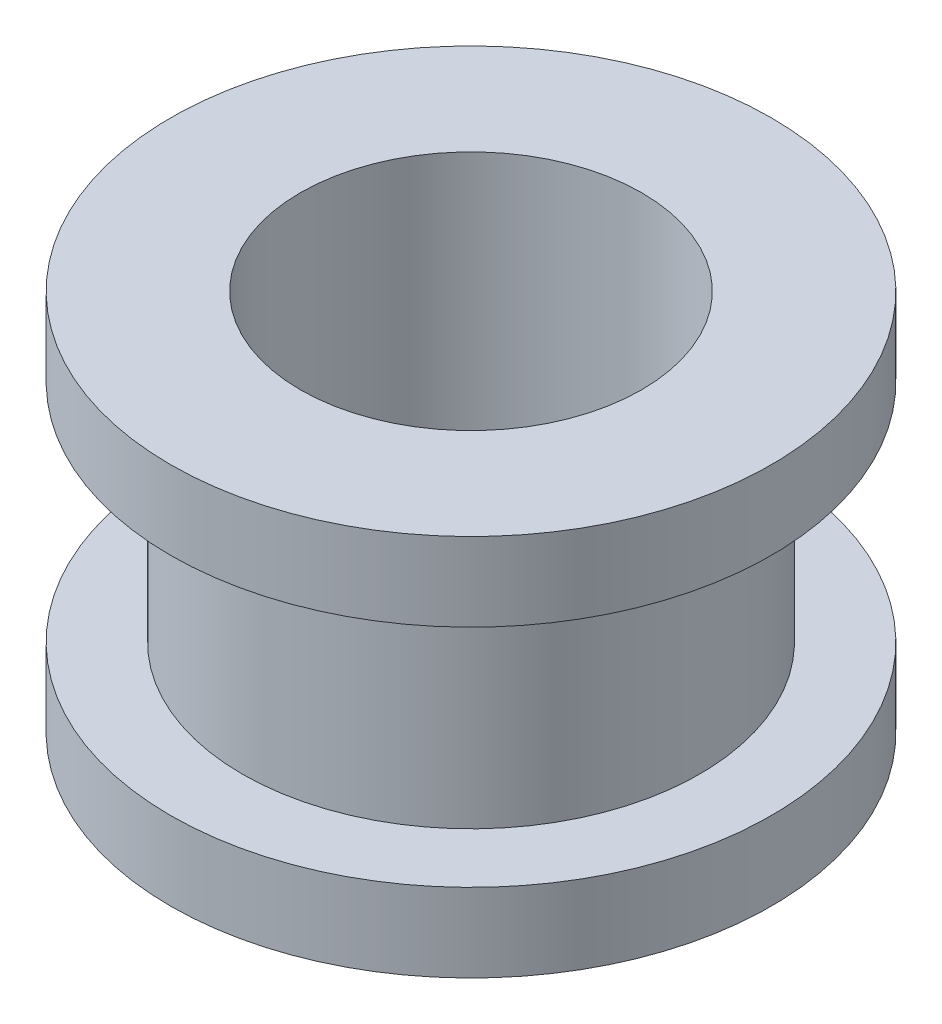
ISO-10303-21;
HEADER;
FILE_DESCRIPTION(('STEP AP214'),'2;1');
FILE_NAME('part.step','',(''),(''),'','','');
FILE_SCHEMA(('AUTOMOTIVE_DESIGN { 1 0 10303 214 1 1 1 1 }'));
ENDSEC;
DATA;
#1=APPLICATION_CONTEXT('core data for automotive mechanical design processes');
#2=APPLICATION_PROTOCOL_DEFINITION('international standard','automotive_design',2000,#1);
#3=PRODUCT_CONTEXT('',#1,'mechanical');
#4=PRODUCT('Part','Part','',(#3));
#5=PRODUCT_RELATED_PRODUCT_CATEGORY('part','',(#4));
#6=PRODUCT_DEFINITION_FORMATION('','',#4);
#7=PRODUCT_DEFINITION_CONTEXT('part definition',#1,'design');
#8=PRODUCT_DEFINITION('design','',#6,#7);
#9=PRODUCT_DEFINITION_SHAPE('','',#8);
#10=(LENGTH_UNIT() NAMED_UNIT(*) SI_UNIT(.MILLI.,.METRE.));
#11=(NAMED_UNIT(*) PLANE_ANGLE_UNIT() SI_UNIT($,.RADIAN.));
#12=(NAMED_UNIT(*) SI_UNIT($,.STERADIAN.) SOLID_ANGLE_UNIT());
#13=UNCERTAINTY_MEASURE_WITH_UNIT(LENGTH_MEASURE(1.E-05),#10,'distance_accuracy_value','');
#14=(GEOMETRIC_REPRESENTATION_CONTEXT(3) GLOBAL_UNCERTAINTY_ASSIGNED_CONTEXT((#13)) GLOBAL_UNIT_ASSIGNED_CONTEXT((#10,
#11,#12)) REPRESENTATION_CONTEXT('',''));
#15=CARTESIAN_POINT('',(0.,0.,0.));
#16=DIRECTION('',(0.,0.,1.));
#17=DIRECTION('',(1.,0.,0.));
#18=AXIS2_PLACEMENT_3D('',#15,#16,#17);
#19=CARTESIAN_POINT('',(0.,5.6,0.));
#20=DIRECTION('',(0.,-1.,0.));
#21=DIRECTION('',(0.,0.,-1.));
#22=AXIS2_PLACEMENT_3D('',#19,#20,#21);
#23=PLANE('',#22);
#24=CARTESIAN_POINT('',(0.,5.6,0.));
#25=DIRECTION('',(0.,1.,0.));
#26=DIRECTION('',(0.,0.,1.));
#27=AXIS2_PLACEMENT_3D('',#24,#25,#26);
#28=CIRCLE('',#27,5.);
#29=CARTESIAN_POINT('',(0.,5.6,5.));
#30=VERTEX_POINT('',#29);
#31=EDGE_CURVE('E63',#30,#30,#28,.T.);
#32=ORIENTED_EDGE('',*,*,#31,.F.);
#33=EDGE_LOOP('',(#32));
#34=FACE_BOUND('',#33,.T.);
#35=CARTESIAN_POINT('',(0.,5.6,0.));
#36=DIRECTION('',(0.,-1.,0.));
#37=DIRECTION('',(0.,0.,-1.));
#38=AXIS2_PLACEMENT_3D('',#35,#36,#37);
#39=CIRCLE('',#38,8.8);
#40=CARTESIAN_POINT('',(0.,5.6,-8.8));
#41=VERTEX_POINT('',#40);
#42=EDGE_CURVE('E10',#41,#41,#39,.T.);
#43=ORIENTED_EDGE('',*,*,#42,.F.);
#44=EDGE_LOOP('',(#43));
#45=FACE_BOUND('',#44,.T.);
#46=ADVANCED_FACE('F35',(#34,#45),#23,.F.);
#47=CARTESIAN_POINT('',(0.,-5.6,0.));
#48=DIRECTION('',(0.,-1.,0.));
#49=DIRECTION('',(0.,0.,-1.));
#50=AXIS2_PLACEMENT_3D('',#47,#48,#49);
#51=CYLINDRICAL_SURFACE('',#50,8.8);
#52=CARTESIAN_POINT('',(0.,3.3,0.));
#53=DIRECTION('',(0.,-1.,0.));
#54=DIRECTION('',(0.,0.,-1.));
#55=AXIS2_PLACEMENT_3D('',#52,#53,#54);
#56=CIRCLE('',#55,8.8);
#57=CARTESIAN_POINT('',(0.,3.3,-8.8));
#58=VERTEX_POINT('',#57);
#59=EDGE_CURVE('E41',#58,#58,#56,.T.);
#60=ORIENTED_EDGE('',*,*,#59,.F.);
#61=EDGE_LOOP('',(#60));
#62=FACE_BOUND('',#61,.T.);
#63=ORIENTED_EDGE('',*,*,#42,.T.);
#64=EDGE_LOOP('',(#63));
#65=FACE_BOUND('',#64,.T.);
#66=ADVANCED_FACE('F71',(#62,#65),#51,.T.);
#67=CARTESIAN_POINT('',(-8.8,3.3,0.));
#68=DIRECTION('',(0.,1.,0.));
#69=DIRECTION('',(0.,0.,1.));
#70=AXIS2_PLACEMENT_3D('',#67,#68,#69);
#71=PLANE('',#70);
#72=CARTESIAN_POINT('',(0.,3.3,0.));
#73=DIRECTION('',(0.,-1.,0.));
#74=DIRECTION('',(0.,0.,-1.));
#75=AXIS2_PLACEMENT_3D('',#72,#73,#74);
#76=CIRCLE('',#75,6.7);
#77=CARTESIAN_POINT('',(0.,3.3,-6.7));
#78=VERTEX_POINT('',#77);
#79=EDGE_CURVE('E45',#78,#78,#76,.T.);
#80=ORIENTED_EDGE('',*,*,#79,.F.);
#81=EDGE_LOOP('',(#80));
#82=FACE_BOUND('',#81,.T.);
#83=ORIENTED_EDGE('',*,*,#59,.T.);
#84=EDGE_LOOP('',(#83));
#85=FACE_BOUND('',#84,.T.);
#86=ADVANCED_FACE('F77',(#82,#85),#71,.F.);
#87=CARTESIAN_POINT('',(0.,-5.6,0.));
#88=DIRECTION('',(0.,-1.,0.));
#89=DIRECTION('',(0.,0.,-1.));
#90=AXIS2_PLACEMENT_3D('',#87,#88,#89);
#91=CYLINDRICAL_SURFACE('',#90,6.7);
#92=CARTESIAN_POINT('',(0.,-3.3,0.));
#93=DIRECTION('',(0.,-1.,0.));
#94=DIRECTION('',(0.,0.,-1.));
#95=AXIS2_PLACEMENT_3D('',#92,#93,#94);
#96=CIRCLE('',#95,6.7);
#97=CARTESIAN_POINT('',(0.,-3.3,-6.7));
#98=VERTEX_POINT('',#97);
#99=EDGE_CURVE('E49',#98,#98,#96,.T.);
#100=ORIENTED_EDGE('',*,*,#99,.F.);
#101=EDGE_LOOP('',(#100));
#102=FACE_BOUND('',#101,.T.);
#103=ORIENTED_EDGE('',*,*,#79,.T.);
#104=EDGE_LOOP('',(#103));
#105=FACE_BOUND('',#104,.T.);
#106=ADVANCED_FACE('F82',(#102,#105),#91,.T.);
#107=CARTESIAN_POINT('',(-6.7,-3.3,0.));
#108=DIRECTION('',(0.,-1.,0.));
#109=DIRECTION('',(0.,0.,-1.));
#110=AXIS2_PLACEMENT_3D('',#107,#108,#109);
#111=PLANE('',#110);
#112=CARTESIAN_POINT('',(0.,-3.3,0.));
#113=DIRECTION('',(0.,-1.,0.));
#114=DIRECTION('',(0.,0.,-1.));
#115=AXIS2_PLACEMENT_3D('',#112,#113,#114);
#116=CIRCLE('',#115,8.8);
#117=CARTESIAN_POINT('',(0.,-3.3,-8.8));
#118=VERTEX_POINT('',#117);
#119=EDGE_CURVE('E54',#118,#118,#116,.T.);
#120=ORIENTED_EDGE('',*,*,#119,.F.);
#121=EDGE_LOOP('',(#120));
#122=FACE_BOUND('',#121,.T.);
#123=ORIENTED_EDGE('',*,*,#99,.T.);
#124=EDGE_LOOP('',(#123));
#125=FACE_BOUND('',#124,.T.);
#126=ADVANCED_FACE('F88',(#122,#125),#111,.F.);
#127=CARTESIAN_POINT('',(0.,-5.6,0.));
#128=DIRECTION('',(0.,-1.,0.));
#129=DIRECTION('',(0.,0.,-1.));
#130=AXIS2_PLACEMENT_3D('',#127,#128,#129);
#131=CYLINDRICAL_SURFACE('',#130,8.8);
#132=CARTESIAN_POINT('',(0.,-5.6,0.));
#133=DIRECTION('',(0.,-1.,0.));
#134=DIRECTION('',(0.,0.,-1.));
#135=AXIS2_PLACEMENT_3D('',#132,#133,#134);
#136=CIRCLE('',#135,8.8);
#137=CARTESIAN_POINT('',(0.,-5.6,-8.8));
#138=VERTEX_POINT('',#137);
#139=EDGE_CURVE('E57',#138,#138,#136,.T.);
#140=ORIENTED_EDGE('',*,*,#139,.F.);
#141=EDGE_LOOP('',(#140));
#142=FACE_BOUND('',#141,.T.);
#143=ORIENTED_EDGE('',*,*,#119,.T.);
#144=EDGE_LOOP('',(#143));
#145=FACE_BOUND('',#144,.T.);
#146=ADVANCED_FACE('F92',(#142,#145),#131,.T.);
#147=CARTESIAN_POINT('',(-8.8,-5.6,0.));
#148=DIRECTION('',(0.,1.,0.));
#149=DIRECTION('',(0.,0.,1.));
#150=AXIS2_PLACEMENT_3D('',#147,#148,#149);
#151=PLANE('',#150);
#152=CARTESIAN_POINT('',(0.,-5.6,0.));
#153=DIRECTION('',(0.,1.,0.));
#154=DIRECTION('',(0.,0.,1.));
#155=AXIS2_PLACEMENT_3D('',#152,#153,#154);
#156=CIRCLE('',#155,5.);
#157=CARTESIAN_POINT('',(0.,-5.6,5.));
#158=VERTEX_POINT('',#157);
#159=EDGE_CURVE('E60',#158,#158,#156,.T.);
#160=ORIENTED_EDGE('',*,*,#159,.T.);
#161=EDGE_LOOP('',(#160));
#162=FACE_BOUND('',#161,.T.);
#163=ORIENTED_EDGE('',*,*,#139,.T.);
#164=EDGE_LOOP('',(#163));
#165=FACE_BOUND('',#164,.T.);
#166=ADVANCED_FACE('F95',(#162,#165),#151,.F.);
#167=CARTESIAN_POINT('',(0.,-5.6,0.));
#168=DIRECTION('',(0.,1.,0.));
#169=DIRECTION('',(0.,0.,1.));
#170=AXIS2_PLACEMENT_3D('',#167,#168,#169);
#171=CYLINDRICAL_SURFACE('',#170,5.);
#172=ORIENTED_EDGE('',*,*,#159,.F.);
#173=EDGE_LOOP('',(#172));
#174=FACE_BOUND('',#173,.T.);
#175=ORIENTED_EDGE('',*,*,#31,.T.);
#176=EDGE_LOOP('',(#175));
#177=FACE_BOUND('',#176,.T.);
#178=ADVANCED_FACE('F67',(#174,#177),#171,.F.);
#179=CLOSED_SHELL('',(#46,#66,#86,#106,#126,#146,#166,#178));
#180=MANIFOLD_SOLID_BREP('B2',#179);
#181=ADVANCED_BREP_SHAPE_REPRESENTATION('',(#18,#180),#14);
#182=SHAPE_DEFINITION_REPRESENTATION(#9,#181);
ENDSEC;
END-ISO-10303-21;
